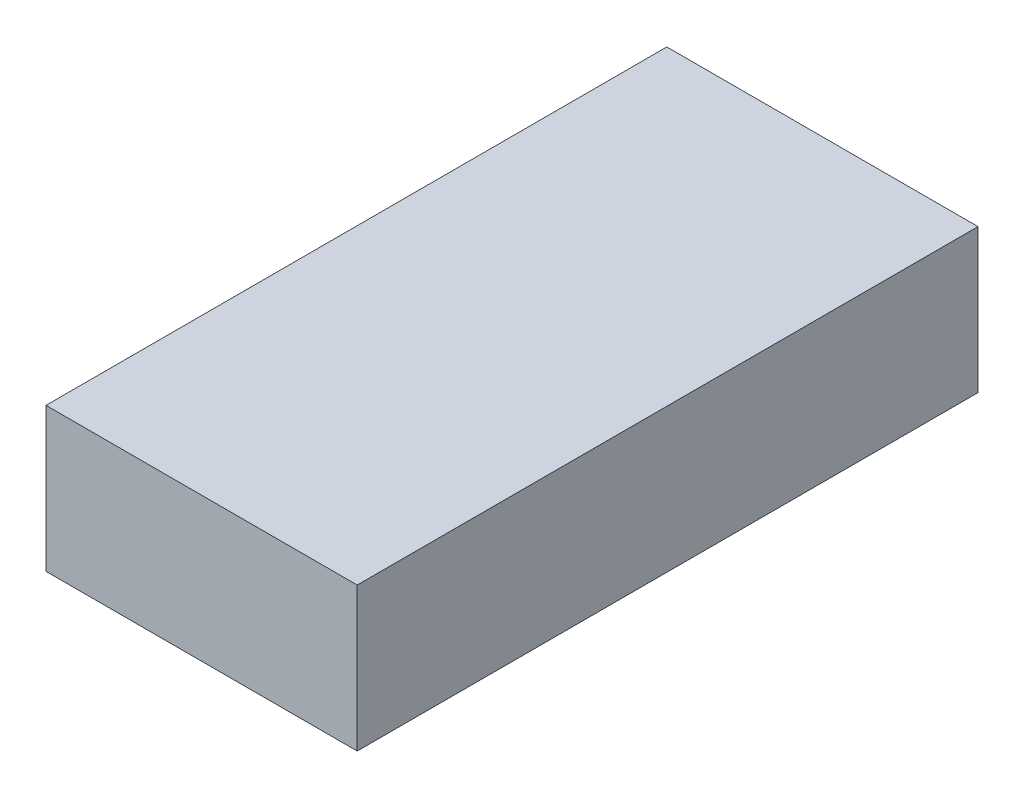
ISO-10303-21;
HEADER;
FILE_DESCRIPTION(('STEP AP214'),'2;1');
FILE_NAME('part.step','',(''),(''),'','','');
FILE_SCHEMA(('AUTOMOTIVE_DESIGN { 1 0 10303 214 1 1 1 1 }'));
ENDSEC;
DATA;
#1=APPLICATION_CONTEXT('core data for automotive mechanical design processes');
#2=APPLICATION_PROTOCOL_DEFINITION('international standard','automotive_design',2000,#1);
#3=PRODUCT_CONTEXT('',#1,'mechanical');
#4=PRODUCT('Part','Part','',(#3));
#5=PRODUCT_RELATED_PRODUCT_CATEGORY('part','',(#4));
#6=PRODUCT_DEFINITION_FORMATION('','',#4);
#7=PRODUCT_DEFINITION_CONTEXT('part definition',#1,'design');
#8=PRODUCT_DEFINITION('design','',#6,#7);
#9=PRODUCT_DEFINITION_SHAPE('','',#8);
#10=(LENGTH_UNIT() NAMED_UNIT(*) SI_UNIT(.MILLI.,.METRE.));
#11=(NAMED_UNIT(*) PLANE_ANGLE_UNIT() SI_UNIT($,.RADIAN.));
#12=(NAMED_UNIT(*) SI_UNIT($,.STERADIAN.) SOLID_ANGLE_UNIT());
#13=UNCERTAINTY_MEASURE_WITH_UNIT(LENGTH_MEASURE(1.E-05),#10,'distance_accuracy_value','');
#14=(GEOMETRIC_REPRESENTATION_CONTEXT(3) GLOBAL_UNCERTAINTY_ASSIGNED_CONTEXT((#13)) GLOBAL_UNIT_ASSIGNED_CONTEXT((#10,
#11,#12)) REPRESENTATION_CONTEXT('',''));
#15=CARTESIAN_POINT('',(0.,0.,0.));
#16=DIRECTION('',(0.,0.,1.));
#17=DIRECTION('',(1.,0.,0.));
#18=AXIS2_PLACEMENT_3D('',#15,#16,#17);
#19=CARTESIAN_POINT('',(75.1927586206896,-34.7425287356322,300.));
#20=DIRECTION('',(-1.,0.,0.));
#21=DIRECTION('',(0.,0.,1.));
#22=AXIS2_PLACEMENT_3D('',#19,#20,#21);
#23=PLANE('',#22);
#24=DIRECTION('',(0.,1.,0.));
#25=VECTOR('',#24,1.);
#26=CARTESIAN_POINT('',(75.1927586206896,-34.7425287356322,0.));
#27=LINE('',#26,#25);
#28=CARTESIAN_POINT('',(75.1927586206896,-34.7425287356322,0.));
#29=VERTEX_POINT('',#28);
#30=CARTESIAN_POINT('',(75.1927586206896,34.7425287356322,0.));
#31=VERTEX_POINT('',#30);
#32=EDGE_CURVE('E107',#29,#31,#27,.T.);
#33=ORIENTED_EDGE('',*,*,#32,.T.);
#34=DIRECTION('',(0.,0.,-1.));
#35=VECTOR('',#34,1.);
#36=CARTESIAN_POINT('',(75.1927586206896,34.7425287356322,300.));
#37=LINE('',#36,#35);
#38=CARTESIAN_POINT('',(75.1927586206896,34.7425287356322,300.));
#39=VERTEX_POINT('',#38);
#40=EDGE_CURVE('E11',#39,#31,#37,.T.);
#41=ORIENTED_EDGE('',*,*,#40,.F.);
#42=DIRECTION('',(0.,1.,0.));
#43=VECTOR('',#42,1.);
#44=CARTESIAN_POINT('',(75.1927586206896,-34.7425287356322,300.));
#45=LINE('',#44,#43);
#46=CARTESIAN_POINT('',(75.1927586206896,-34.7425287356322,300.));
#47=VERTEX_POINT('',#46);
#48=EDGE_CURVE('E91',#47,#39,#45,.T.);
#49=ORIENTED_EDGE('',*,*,#48,.F.);
#50=DIRECTION('',(0.,0.,-1.));
#51=VECTOR('',#50,1.);
#52=CARTESIAN_POINT('',(75.1927586206896,-34.7425287356322,300.));
#53=LINE('',#52,#51);
#54=EDGE_CURVE('E103',#47,#29,#53,.T.);
#55=ORIENTED_EDGE('',*,*,#54,.T.);
#56=EDGE_LOOP('',(#33,#41,#49,#55));
#57=FACE_BOUND('',#56,.T.);
#58=ADVANCED_FACE('F39',(#57),#23,.F.);
#59=CARTESIAN_POINT('',(-75.1927586206896,34.7425287356322,300.));
#60=DIRECTION('',(0.,-1.,0.));
#61=DIRECTION('',(0.,0.,-1.));
#62=AXIS2_PLACEMENT_3D('',#59,#60,#61);
#63=PLANE('',#62);
#64=DIRECTION('',(-1.,0.,0.));
#65=VECTOR('',#64,1.);
#66=CARTESIAN_POINT('',(-75.1927586206896,34.7425287356322,0.));
#67=LINE('',#66,#65);
#68=CARTESIAN_POINT('',(-75.1927586206896,34.7425287356322,0.));
#69=VERTEX_POINT('',#68);
#70=EDGE_CURVE('E96',#31,#69,#67,.T.);
#71=ORIENTED_EDGE('',*,*,#70,.T.);
#72=DIRECTION('',(0.,0.,-1.));
#73=VECTOR('',#72,1.);
#74=CARTESIAN_POINT('',(-75.1927586206896,34.7425287356322,300.));
#75=LINE('',#74,#73);
#76=CARTESIAN_POINT('',(-75.1927586206896,34.7425287356322,300.));
#77=VERTEX_POINT('',#76);
#78=EDGE_CURVE('E48',#77,#69,#75,.T.);
#79=ORIENTED_EDGE('',*,*,#78,.F.);
#80=DIRECTION('',(-1.,0.,0.));
#81=VECTOR('',#80,1.);
#82=CARTESIAN_POINT('',(-75.1927586206896,34.7425287356322,300.));
#83=LINE('',#82,#81);
#84=EDGE_CURVE('E86',#39,#77,#83,.T.);
#85=ORIENTED_EDGE('',*,*,#84,.F.);
#86=ORIENTED_EDGE('',*,*,#40,.T.);
#87=EDGE_LOOP('',(#71,#79,#85,#86));
#88=FACE_BOUND('',#87,.T.);
#89=ADVANCED_FACE('F95',(#88),#63,.F.);
#90=CARTESIAN_POINT('',(-75.1927586206896,-34.7425287356322,300.));
#91=DIRECTION('',(1.,0.,0.));
#92=DIRECTION('',(0.,0.,-1.));
#93=AXIS2_PLACEMENT_3D('',#90,#91,#92);
#94=PLANE('',#93);
#95=DIRECTION('',(0.,-1.,0.));
#96=VECTOR('',#95,1.);
#97=CARTESIAN_POINT('',(-75.1927586206896,-34.7425287356322,0.));
#98=LINE('',#97,#96);
#99=CARTESIAN_POINT('',(-75.1927586206896,-34.7425287356322,0.));
#100=VERTEX_POINT('',#99);
#101=EDGE_CURVE('E73',#69,#100,#98,.T.);
#102=ORIENTED_EDGE('',*,*,#101,.T.);
#103=DIRECTION('',(0.,0.,-1.));
#104=VECTOR('',#103,1.);
#105=CARTESIAN_POINT('',(-75.1927586206896,-34.7425287356322,300.));
#106=LINE('',#105,#104);
#107=CARTESIAN_POINT('',(-75.1927586206896,-34.7425287356322,300.));
#108=VERTEX_POINT('',#107);
#109=EDGE_CURVE('E98',#108,#100,#106,.T.);
#110=ORIENTED_EDGE('',*,*,#109,.F.);
#111=DIRECTION('',(0.,-1.,0.));
#112=VECTOR('',#111,1.);
#113=CARTESIAN_POINT('',(-75.1927586206896,-34.7425287356322,300.));
#114=LINE('',#113,#112);
#115=EDGE_CURVE('E89',#77,#108,#114,.T.);
#116=ORIENTED_EDGE('',*,*,#115,.F.);
#117=ORIENTED_EDGE('',*,*,#78,.T.);
#118=EDGE_LOOP('',(#102,#110,#116,#117));
#119=FACE_BOUND('',#118,.T.);
#120=ADVANCED_FACE('F99',(#119),#94,.F.);
#121=CARTESIAN_POINT('',(-75.1927586206896,-34.7425287356322,300.));
#122=DIRECTION('',(0.,1.,0.));
#123=DIRECTION('',(0.,0.,1.));
#124=AXIS2_PLACEMENT_3D('',#121,#122,#123);
#125=PLANE('',#124);
#126=DIRECTION('',(1.,0.,0.));
#127=VECTOR('',#126,1.);
#128=CARTESIAN_POINT('',(-75.1927586206896,-34.7425287356322,0.));
#129=LINE('',#128,#127);
#130=EDGE_CURVE('E79',#100,#29,#129,.T.);
#131=ORIENTED_EDGE('',*,*,#130,.T.);
#132=ORIENTED_EDGE('',*,*,#54,.F.);
#133=DIRECTION('',(1.,0.,0.));
#134=VECTOR('',#133,1.);
#135=CARTESIAN_POINT('',(-75.1927586206896,-34.7425287356322,300.));
#136=LINE('',#135,#134);
#137=EDGE_CURVE('E56',#108,#47,#136,.T.);
#138=ORIENTED_EDGE('',*,*,#137,.F.);
#139=ORIENTED_EDGE('',*,*,#109,.T.);
#140=EDGE_LOOP('',(#131,#132,#138,#139));
#141=FACE_BOUND('',#140,.T.);
#142=ADVANCED_FACE('F120',(#141),#125,.F.);
#143=CARTESIAN_POINT('',(0.,0.,300.));
#144=DIRECTION('',(0.,0.,-1.));
#145=DIRECTION('',(-1.,0.,0.));
#146=AXIS2_PLACEMENT_3D('',#143,#144,#145);
#147=PLANE('',#146);
#148=ORIENTED_EDGE('',*,*,#48,.T.);
#149=ORIENTED_EDGE('',*,*,#84,.T.);
#150=ORIENTED_EDGE('',*,*,#115,.T.);
#151=ORIENTED_EDGE('',*,*,#137,.T.);
#152=EDGE_LOOP('',(#148,#149,#150,#151));
#153=FACE_BOUND('',#152,.T.);
#154=ADVANCED_FACE('F87',(#153),#147,.F.);
#155=CARTESIAN_POINT('',(0.,0.,0.));
#156=DIRECTION('',(0.,0.,-1.));
#157=DIRECTION('',(-1.,0.,0.));
#158=AXIS2_PLACEMENT_3D('',#155,#156,#157);
#159=PLANE('',#158);
#160=ORIENTED_EDGE('',*,*,#32,.F.);
#161=ORIENTED_EDGE('',*,*,#130,.F.);
#162=ORIENTED_EDGE('',*,*,#101,.F.);
#163=ORIENTED_EDGE('',*,*,#70,.F.);
#164=EDGE_LOOP('',(#160,#161,#162,#163));
#165=FACE_BOUND('',#164,.T.);
#166=ADVANCED_FACE('F123',(#165),#159,.T.);
#167=CLOSED_SHELL('',(#58,#89,#120,#142,#154,#166));
#168=MANIFOLD_SOLID_BREP('B2',#167);
#169=ADVANCED_BREP_SHAPE_REPRESENTATION('',(#18,#168),#14);
#170=SHAPE_DEFINITION_REPRESENTATION(#9,#169);
ENDSEC;
END-ISO-10303-21;
